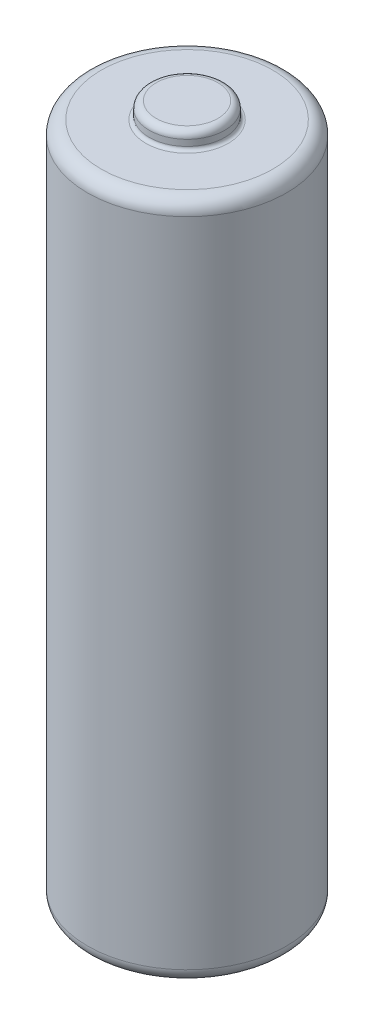
ISO-10303-21;
HEADER;
FILE_DESCRIPTION(('STEP AP214'),'2;1');
FILE_NAME('part.step','',(''),(''),'','','');
FILE_SCHEMA(('AUTOMOTIVE_DESIGN { 1 0 10303 214 1 1 1 1 }'));
ENDSEC;
DATA;
#1=APPLICATION_CONTEXT('core data for automotive mechanical design processes');
#2=APPLICATION_PROTOCOL_DEFINITION('international standard','automotive_design',2000,#1);
#3=PRODUCT_CONTEXT('',#1,'mechanical');
#4=PRODUCT('Part','Part','',(#3));
#5=PRODUCT_RELATED_PRODUCT_CATEGORY('part','',(#4));
#6=PRODUCT_DEFINITION_FORMATION('','',#4);
#7=PRODUCT_DEFINITION_CONTEXT('part definition',#1,'design');
#8=PRODUCT_DEFINITION('design','',#6,#7);
#9=PRODUCT_DEFINITION_SHAPE('','',#8);
#10=(LENGTH_UNIT() NAMED_UNIT(*) SI_UNIT(.MILLI.,.METRE.));
#11=(NAMED_UNIT(*) PLANE_ANGLE_UNIT() SI_UNIT($,.RADIAN.));
#12=(NAMED_UNIT(*) SI_UNIT($,.STERADIAN.) SOLID_ANGLE_UNIT());
#13=UNCERTAINTY_MEASURE_WITH_UNIT(LENGTH_MEASURE(1.E-05),#10,'distance_accuracy_value','');
#14=(GEOMETRIC_REPRESENTATION_CONTEXT(3) GLOBAL_UNCERTAINTY_ASSIGNED_CONTEXT((#13)) GLOBAL_UNIT_ASSIGNED_CONTEXT((#10,
#11,#12)) REPRESENTATION_CONTEXT('',''));
#15=CARTESIAN_POINT('',(0.,0.,0.));
#16=DIRECTION('',(0.,0.,1.));
#17=DIRECTION('',(1.,0.,0.));
#18=AXIS2_PLACEMENT_3D('',#15,#16,#17);
#19=CARTESIAN_POINT('',(0.,49.5,0.));
#20=DIRECTION('',(0.,1.,0.));
#21=DIRECTION('',(0.,0.,1.));
#22=AXIS2_PLACEMENT_3D('',#19,#20,#21);
#23=PLANE('',#22);
#24=CARTESIAN_POINT('',(0.,49.5,0.));
#25=DIRECTION('',(0.,1.,0.));
#26=DIRECTION('',(0.,0.,1.));
#27=AXIS2_PLACEMENT_3D('',#24,#25,#26);
#28=CIRCLE('',#27,3.);
#29=CARTESIAN_POINT('',(0.,49.5,3.));
#30=VERTEX_POINT('',#29);
#31=EDGE_CURVE('E44',#30,#30,#28,.F.);
#32=ORIENTED_EDGE('',*,*,#31,.T.);
#33=EDGE_LOOP('',(#32));
#34=FACE_BOUND('',#33,.T.);
#35=CARTESIAN_POINT('',(0.,49.5,0.));
#36=DIRECTION('',(0.,1.,0.));
#37=DIRECTION('',(0.,0.,1.));
#38=AXIS2_PLACEMENT_3D('',#35,#36,#37);
#39=CIRCLE('',#38,6.25);
#40=CARTESIAN_POINT('',(0.,49.5,6.25));
#41=VERTEX_POINT('',#40);
#42=EDGE_CURVE('E53',#41,#41,#39,.T.);
#43=ORIENTED_EDGE('',*,*,#42,.T.);
#44=EDGE_LOOP('',(#43));
#45=FACE_BOUND('',#44,.T.);
#46=ADVANCED_FACE('F33',(#34,#45),#23,.T.);
#47=CARTESIAN_POINT('',(0.,49.5,0.));
#48=DIRECTION('',(0.,-1.,0.));
#49=DIRECTION('',(0.,0.,-1.));
#50=AXIS2_PLACEMENT_3D('',#47,#48,#49);
#51=CYLINDRICAL_SURFACE('',#50,7.25);
#52=CARTESIAN_POINT('',(0.,1.,0.));
#53=DIRECTION('',(0.,1.,0.));
#54=DIRECTION('',(0.,0.,1.));
#55=AXIS2_PLACEMENT_3D('',#52,#53,#54);
#56=CIRCLE('',#55,7.25);
#57=CARTESIAN_POINT('',(0.,1.,7.25));
#58=VERTEX_POINT('',#57);
#59=EDGE_CURVE('E59',#58,#58,#56,.T.);
#60=ORIENTED_EDGE('',*,*,#59,.T.);
#61=EDGE_LOOP('',(#60));
#62=FACE_BOUND('',#61,.T.);
#63=CARTESIAN_POINT('',(0.,48.5,0.));
#64=DIRECTION('',(0.,1.,0.));
#65=DIRECTION('',(0.,0.,1.));
#66=AXIS2_PLACEMENT_3D('',#63,#64,#65);
#67=CIRCLE('',#66,7.25);
#68=CARTESIAN_POINT('',(0.,48.5,7.25));
#69=VERTEX_POINT('',#68);
#70=EDGE_CURVE('E62',#69,#69,#67,.F.);
#71=ORIENTED_EDGE('',*,*,#70,.T.);
#72=EDGE_LOOP('',(#71));
#73=FACE_BOUND('',#72,.T.);
#74=ADVANCED_FACE('F66',(#62,#73),#51,.T.);
#75=CARTESIAN_POINT('',(0.,0.,0.));
#76=DIRECTION('',(0.,1.,0.));
#77=DIRECTION('',(0.,0.,1.));
#78=AXIS2_PLACEMENT_3D('',#75,#76,#77);
#79=PLANE('',#78);
#80=CARTESIAN_POINT('',(0.,0.,0.));
#81=DIRECTION('',(0.,1.,0.));
#82=DIRECTION('',(0.,0.,1.));
#83=AXIS2_PLACEMENT_3D('',#80,#81,#82);
#84=CIRCLE('',#83,6.25);
#85=CARTESIAN_POINT('',(0.,0.,6.25));
#86=VERTEX_POINT('',#85);
#87=EDGE_CURVE('E56',#86,#86,#84,.F.);
#88=ORIENTED_EDGE('',*,*,#87,.T.);
#89=EDGE_LOOP('',(#88));
#90=FACE_BOUND('',#89,.T.);
#91=ADVANCED_FACE('F82',(#90),#79,.F.);
#92=CARTESIAN_POINT('',(0.,50.7,0.));
#93=DIRECTION('',(0.,-1.,0.));
#94=DIRECTION('',(0.,0.,-1.));
#95=AXIS2_PLACEMENT_3D('',#92,#93,#94);
#96=CYLINDRICAL_SURFACE('',#95,2.75);
#97=CARTESIAN_POINT('',(0.,50.2,0.));
#98=DIRECTION('',(0.,1.,0.));
#99=DIRECTION('',(0.,0.,1.));
#100=AXIS2_PLACEMENT_3D('',#97,#98,#99);
#101=CIRCLE('',#100,2.75);
#102=CARTESIAN_POINT('',(0.,50.2,2.75));
#103=VERTEX_POINT('',#102);
#104=EDGE_CURVE('E10',#103,#103,#101,.F.);
#105=ORIENTED_EDGE('',*,*,#104,.T.);
#106=EDGE_LOOP('',(#105));
#107=FACE_BOUND('',#106,.T.);
#108=CARTESIAN_POINT('',(0.,49.75,0.));
#109=DIRECTION('',(0.,1.,0.));
#110=DIRECTION('',(0.,0.,1.));
#111=AXIS2_PLACEMENT_3D('',#108,#109,#110);
#112=CIRCLE('',#111,2.75);
#113=CARTESIAN_POINT('',(0.,49.75,2.75));
#114=VERTEX_POINT('',#113);
#115=EDGE_CURVE('E48',#114,#114,#112,.T.);
#116=ORIENTED_EDGE('',*,*,#115,.T.);
#117=EDGE_LOOP('',(#116));
#118=FACE_BOUND('',#117,.T.);
#119=ADVANCED_FACE('F87',(#107,#118),#96,.T.);
#120=CARTESIAN_POINT('',(0.,50.7,0.));
#121=DIRECTION('',(0.,1.,0.));
#122=DIRECTION('',(0.,0.,1.));
#123=AXIS2_PLACEMENT_3D('',#120,#121,#122);
#124=PLANE('',#123);
#125=CARTESIAN_POINT('',(0.,50.7,0.));
#126=DIRECTION('',(0.,1.,0.));
#127=DIRECTION('',(0.,0.,1.));
#128=AXIS2_PLACEMENT_3D('',#125,#126,#127);
#129=CIRCLE('',#128,2.25);
#130=CARTESIAN_POINT('',(0.,50.7,2.25));
#131=VERTEX_POINT('',#130);
#132=EDGE_CURVE('E40',#131,#131,#129,.T.);
#133=ORIENTED_EDGE('',*,*,#132,.T.);
#134=EDGE_LOOP('',(#133));
#135=FACE_BOUND('',#134,.T.);
#136=ADVANCED_FACE('F93',(#135),#124,.T.);
#137=CARTESIAN_POINT('',(0.,1.,0.));
#138=DIRECTION('',(0.,1.,0.));
#139=DIRECTION('',(0.,0.,1.));
#140=AXIS2_PLACEMENT_3D('',#137,#138,#139);
#141=TOROIDAL_SURFACE('',#140,6.25,1.);
#142=ORIENTED_EDGE('',*,*,#87,.F.);
#143=EDGE_LOOP('',(#142));
#144=FACE_BOUND('',#143,.T.);
#145=ORIENTED_EDGE('',*,*,#59,.F.);
#146=EDGE_LOOP('',(#145));
#147=FACE_BOUND('',#146,.T.);
#148=ADVANCED_FACE('F72',(#144,#147),#141,.T.);
#149=CARTESIAN_POINT('',(0.,48.5,0.));
#150=DIRECTION('',(0.,1.,0.));
#151=DIRECTION('',(0.,0.,1.));
#152=AXIS2_PLACEMENT_3D('',#149,#150,#151);
#153=TOROIDAL_SURFACE('',#152,6.25,1.);
#154=ORIENTED_EDGE('',*,*,#70,.F.);
#155=EDGE_LOOP('',(#154));
#156=FACE_BOUND('',#155,.T.);
#157=ORIENTED_EDGE('',*,*,#42,.F.);
#158=EDGE_LOOP('',(#157));
#159=FACE_BOUND('',#158,.T.);
#160=ADVANCED_FACE('F68',(#156,#159),#153,.T.);
#161=CARTESIAN_POINT('',(0.,49.75,0.));
#162=DIRECTION('',(0.,1.,0.));
#163=DIRECTION('',(0.,0.,1.));
#164=AXIS2_PLACEMENT_3D('',#161,#162,#163);
#165=TOROIDAL_SURFACE('',#164,3.,0.25);
#166=ORIENTED_EDGE('',*,*,#31,.F.);
#167=EDGE_LOOP('',(#166));
#168=FACE_BOUND('',#167,.T.);
#169=ORIENTED_EDGE('',*,*,#115,.F.);
#170=EDGE_LOOP('',(#169));
#171=FACE_BOUND('',#170,.T.);
#172=ADVANCED_FACE('F71',(#168,#171),#165,.F.);
#173=CARTESIAN_POINT('',(0.,50.2,0.));
#174=DIRECTION('',(0.,1.,0.));
#175=DIRECTION('',(0.,0.,1.));
#176=AXIS2_PLACEMENT_3D('',#173,#174,#175);
#177=TOROIDAL_SURFACE('',#176,2.25,0.5);
#178=ORIENTED_EDGE('',*,*,#104,.F.);
#179=EDGE_LOOP('',(#178));
#180=FACE_BOUND('',#179,.T.);
#181=ORIENTED_EDGE('',*,*,#132,.F.);
#182=EDGE_LOOP('',(#181));
#183=FACE_BOUND('',#182,.T.);
#184=ADVANCED_FACE('F35',(#180,#183),#177,.T.);
#185=CLOSED_SHELL('',(#46,#74,#91,#119,#136,#148,#160,#172,#184));
#186=MANIFOLD_SOLID_BREP('B2',#185);
#187=ADVANCED_BREP_SHAPE_REPRESENTATION('',(#18,#186),#14);
#188=SHAPE_DEFINITION_REPRESENTATION(#9,#187);
ENDSEC;
END-ISO-10303-21;
